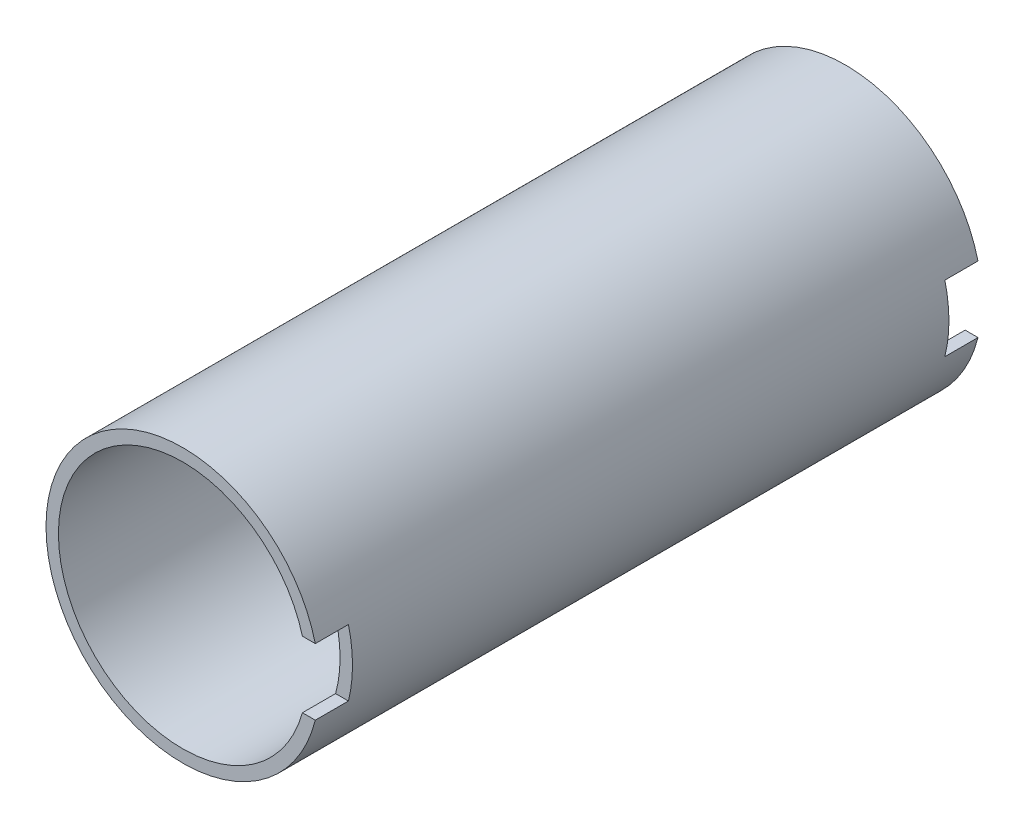
ISO-10303-21;
HEADER;
FILE_DESCRIPTION(('STEP AP214'),'2;1');
FILE_NAME('part.step','',(''),(''),'','','');
FILE_SCHEMA(('AUTOMOTIVE_DESIGN { 1 0 10303 214 1 1 1 1 }'));
ENDSEC;
DATA;
#1=APPLICATION_CONTEXT('core data for automotive mechanical design processes');
#2=APPLICATION_PROTOCOL_DEFINITION('international standard','automotive_design',2000,#1);
#3=PRODUCT_CONTEXT('',#1,'mechanical');
#4=PRODUCT('Part','Part','',(#3));
#5=PRODUCT_RELATED_PRODUCT_CATEGORY('part','',(#4));
#6=PRODUCT_DEFINITION_FORMATION('','',#4);
#7=PRODUCT_DEFINITION_CONTEXT('part definition',#1,'design');
#8=PRODUCT_DEFINITION('design','',#6,#7);
#9=PRODUCT_DEFINITION_SHAPE('','',#8);
#10=(LENGTH_UNIT() NAMED_UNIT(*) SI_UNIT(.MILLI.,.METRE.));
#11=(NAMED_UNIT(*) PLANE_ANGLE_UNIT() SI_UNIT($,.RADIAN.));
#12=(NAMED_UNIT(*) SI_UNIT($,.STERADIAN.) SOLID_ANGLE_UNIT());
#13=UNCERTAINTY_MEASURE_WITH_UNIT(LENGTH_MEASURE(1.E-05),#10,'distance_accuracy_value','');
#14=(GEOMETRIC_REPRESENTATION_CONTEXT(3) GLOBAL_UNCERTAINTY_ASSIGNED_CONTEXT((#13)) GLOBAL_UNIT_ASSIGNED_CONTEXT((#10,
#11,#12)) REPRESENTATION_CONTEXT('',''));
#15=CARTESIAN_POINT('',(0.,0.,0.));
#16=DIRECTION('',(0.,0.,1.));
#17=DIRECTION('',(1.,0.,0.));
#18=AXIS2_PLACEMENT_3D('',#15,#16,#17);
#19=CARTESIAN_POINT('',(0.,0.,40.));
#20=DIRECTION('',(0.,0.,1.));
#21=DIRECTION('',(1.,0.,0.));
#22=AXIS2_PLACEMENT_3D('',#19,#20,#21);
#23=PLANE('',#22);
#24=CARTESIAN_POINT('',(0.,0.,40.));
#25=DIRECTION('',(0.,0.,1.));
#26=DIRECTION('',(1.,0.,0.));
#27=AXIS2_PLACEMENT_3D('',#24,#25,#26);
#28=CIRCLE('',#27,16.5);
#29=CARTESIAN_POINT('',(16.0078105935821,4.,40.));
#30=VERTEX_POINT('',#29);
#31=CARTESIAN_POINT('',(16.0078105935821,-4.,40.));
#32=VERTEX_POINT('',#31);
#33=EDGE_CURVE('E143',#30,#32,#28,.T.);
#34=ORIENTED_EDGE('',*,*,#33,.T.);
#35=DIRECTION('',(-1.,0.,0.));
#36=VECTOR('',#35,1.);
#37=CARTESIAN_POINT('',(16.5,-4.,40.));
#38=LINE('',#37,#36);
#39=CARTESIAN_POINT('',(14.456832294801,-4.,40.));
#40=VERTEX_POINT('',#39);
#41=EDGE_CURVE('E164',#32,#40,#38,.T.);
#42=ORIENTED_EDGE('',*,*,#41,.T.);
#43=CARTESIAN_POINT('',(0.,0.,40.));
#44=DIRECTION('',(0.,0.,1.));
#45=DIRECTION('',(1.,0.,0.));
#46=AXIS2_PLACEMENT_3D('',#43,#44,#45);
#47=CIRCLE('',#46,15.);
#48=CARTESIAN_POINT('',(14.456832294801,4.,40.));
#49=VERTEX_POINT('',#48);
#50=EDGE_CURVE('E131',#49,#40,#47,.T.);
#51=ORIENTED_EDGE('',*,*,#50,.F.);
#52=DIRECTION('',(-1.,0.,0.));
#53=VECTOR('',#52,1.);
#54=CARTESIAN_POINT('',(16.5,4.,40.));
#55=LINE('',#54,#53);
#56=EDGE_CURVE('E67',#30,#49,#55,.T.);
#57=ORIENTED_EDGE('',*,*,#56,.F.);
#58=EDGE_LOOP('',(#34,#42,#51,#57));
#59=FACE_BOUND('',#58,.T.);
#60=ADVANCED_FACE('F43',(#59),#23,.T.);
#61=CARTESIAN_POINT('',(0.,0.,40.));
#62=DIRECTION('',(0.,0.,-1.));
#63=DIRECTION('',(-1.,0.,0.));
#64=AXIS2_PLACEMENT_3D('',#61,#62,#63);
#65=CYLINDRICAL_SURFACE('',#64,16.5);
#66=CARTESIAN_POINT('',(0.,0.,-36.));
#67=DIRECTION('',(0.,0.,1.));
#68=DIRECTION('',(1.,0.,0.));
#69=AXIS2_PLACEMENT_3D('',#66,#67,#68);
#70=CIRCLE('',#69,16.5);
#71=CARTESIAN_POINT('',(16.0078105935821,-4.,-36.));
#72=VERTEX_POINT('',#71);
#73=CARTESIAN_POINT('',(16.0078105935821,4.,-36.));
#74=VERTEX_POINT('',#73);
#75=EDGE_CURVE('E198',#72,#74,#70,.T.);
#76=ORIENTED_EDGE('',*,*,#75,.T.);
#77=DIRECTION('',(0.,0.,-1.));
#78=VECTOR('',#77,1.);
#79=CARTESIAN_POINT('',(16.0078105935821,4.,40.));
#80=LINE('',#79,#78);
#81=CARTESIAN_POINT('',(16.0078105935821,4.,-40.));
#82=VERTEX_POINT('',#81);
#83=EDGE_CURVE('E200',#74,#82,#80,.T.);
#84=ORIENTED_EDGE('',*,*,#83,.T.);
#85=CARTESIAN_POINT('',(0.,0.,-40.));
#86=DIRECTION('',(0.,0.,1.));
#87=DIRECTION('',(1.,0.,0.));
#88=AXIS2_PLACEMENT_3D('',#85,#86,#87);
#89=CIRCLE('',#88,16.5);
#90=CARTESIAN_POINT('',(16.0078105935821,-4.,-40.));
#91=VERTEX_POINT('',#90);
#92=EDGE_CURVE('E137',#82,#91,#89,.T.);
#93=ORIENTED_EDGE('',*,*,#92,.T.);
#94=DIRECTION('',(0.,0.,-1.));
#95=VECTOR('',#94,1.);
#96=CARTESIAN_POINT('',(16.0078105935821,-4.,40.));
#97=LINE('',#96,#95);
#98=EDGE_CURVE('E59',#91,#72,#97,.F.);
#99=ORIENTED_EDGE('',*,*,#98,.T.);
#100=EDGE_LOOP('',(#76,#84,#93,#99));
#101=FACE_BOUND('',#100,.T.);
#102=CARTESIAN_POINT('',(0.,0.,36.));
#103=DIRECTION('',(0.,0.,1.));
#104=DIRECTION('',(1.,0.,0.));
#105=AXIS2_PLACEMENT_3D('',#102,#103,#104);
#106=CIRCLE('',#105,16.5);
#107=CARTESIAN_POINT('',(16.0078105935821,-4.,36.));
#108=VERTEX_POINT('',#107);
#109=CARTESIAN_POINT('',(16.0078105935821,4.,36.));
#110=VERTEX_POINT('',#109);
#111=EDGE_CURVE('E140',#108,#110,#106,.T.);
#112=ORIENTED_EDGE('',*,*,#111,.F.);
#113=DIRECTION('',(0.,0.,-1.));
#114=VECTOR('',#113,1.);
#115=CARTESIAN_POINT('',(16.0078105935821,-4.,40.));
#116=LINE('',#115,#114);
#117=EDGE_CURVE('E132',#32,#108,#116,.T.);
#118=ORIENTED_EDGE('',*,*,#117,.F.);
#119=ORIENTED_EDGE('',*,*,#33,.F.);
#120=DIRECTION('',(0.,0.,-1.));
#121=VECTOR('',#120,1.);
#122=CARTESIAN_POINT('',(16.0078105935821,4.,40.));
#123=LINE('',#122,#121);
#124=EDGE_CURVE('E171',#110,#30,#123,.F.);
#125=ORIENTED_EDGE('',*,*,#124,.F.);
#126=EDGE_LOOP('',(#112,#118,#119,#125));
#127=FACE_BOUND('',#126,.T.);
#128=ADVANCED_FACE('F45',(#101,#127),#65,.T.);
#129=CARTESIAN_POINT('',(0.,0.,40.));
#130=DIRECTION('',(0.,0.,-1.));
#131=DIRECTION('',(-1.,0.,0.));
#132=AXIS2_PLACEMENT_3D('',#129,#130,#131);
#133=CYLINDRICAL_SURFACE('',#132,15.);
#134=DIRECTION('',(0.,0.,-1.));
#135=VECTOR('',#134,1.);
#136=CARTESIAN_POINT('',(14.456832294801,4.,40.));
#137=LINE('',#136,#135);
#138=CARTESIAN_POINT('',(14.456832294801,4.,-36.));
#139=VERTEX_POINT('',#138);
#140=CARTESIAN_POINT('',(14.456832294801,4.,-40.));
#141=VERTEX_POINT('',#140);
#142=EDGE_CURVE('E209',#139,#141,#137,.T.);
#143=ORIENTED_EDGE('',*,*,#142,.F.);
#144=CARTESIAN_POINT('',(0.,0.,-36.));
#145=DIRECTION('',(0.,0.,1.));
#146=DIRECTION('',(1.,0.,0.));
#147=AXIS2_PLACEMENT_3D('',#144,#145,#146);
#148=CIRCLE('',#147,15.);
#149=CARTESIAN_POINT('',(14.456832294801,-4.,-36.));
#150=VERTEX_POINT('',#149);
#151=EDGE_CURVE('E11',#150,#139,#148,.T.);
#152=ORIENTED_EDGE('',*,*,#151,.F.);
#153=DIRECTION('',(0.,0.,-1.));
#154=VECTOR('',#153,1.);
#155=CARTESIAN_POINT('',(14.456832294801,-4.,40.));
#156=LINE('',#155,#154);
#157=CARTESIAN_POINT('',(14.456832294801,-4.,-40.));
#158=VERTEX_POINT('',#157);
#159=EDGE_CURVE('E109',#158,#150,#156,.F.);
#160=ORIENTED_EDGE('',*,*,#159,.F.);
#161=CARTESIAN_POINT('',(0.,0.,-40.));
#162=DIRECTION('',(0.,0.,1.));
#163=DIRECTION('',(1.,0.,0.));
#164=AXIS2_PLACEMENT_3D('',#161,#162,#163);
#165=CIRCLE('',#164,15.);
#166=EDGE_CURVE('E124',#141,#158,#165,.T.);
#167=ORIENTED_EDGE('',*,*,#166,.F.);
#168=EDGE_LOOP('',(#143,#152,#160,#167));
#169=FACE_BOUND('',#168,.T.);
#170=ORIENTED_EDGE('',*,*,#50,.T.);
#171=DIRECTION('',(0.,0.,-1.));
#172=VECTOR('',#171,1.);
#173=CARTESIAN_POINT('',(14.456832294801,-4.,40.));
#174=LINE('',#173,#172);
#175=CARTESIAN_POINT('',(14.456832294801,-4.,36.));
#176=VERTEX_POINT('',#175);
#177=EDGE_CURVE('E116',#40,#176,#174,.T.);
#178=ORIENTED_EDGE('',*,*,#177,.T.);
#179=CARTESIAN_POINT('',(0.,0.,36.));
#180=DIRECTION('',(0.,0.,1.));
#181=DIRECTION('',(1.,0.,0.));
#182=AXIS2_PLACEMENT_3D('',#179,#180,#181);
#183=CIRCLE('',#182,15.);
#184=CARTESIAN_POINT('',(14.456832294801,4.,36.));
#185=VERTEX_POINT('',#184);
#186=EDGE_CURVE('E152',#176,#185,#183,.T.);
#187=ORIENTED_EDGE('',*,*,#186,.T.);
#188=DIRECTION('',(0.,0.,-1.));
#189=VECTOR('',#188,1.);
#190=CARTESIAN_POINT('',(14.456832294801,4.,40.));
#191=LINE('',#190,#189);
#192=EDGE_CURVE('E147',#185,#49,#191,.F.);
#193=ORIENTED_EDGE('',*,*,#192,.T.);
#194=EDGE_LOOP('',(#170,#178,#187,#193));
#195=FACE_BOUND('',#194,.T.);
#196=ADVANCED_FACE('F122',(#169,#195),#133,.F.);
#197=CARTESIAN_POINT('',(0.,0.,-40.));
#198=DIRECTION('',(0.,0.,1.));
#199=DIRECTION('',(1.,0.,0.));
#200=AXIS2_PLACEMENT_3D('',#197,#198,#199);
#201=PLANE('',#200);
#202=ORIENTED_EDGE('',*,*,#92,.F.);
#203=DIRECTION('',(-1.,0.,0.));
#204=VECTOR('',#203,1.);
#205=CARTESIAN_POINT('',(0.,4.,-40.));
#206=LINE('',#205,#204);
#207=EDGE_CURVE('E52',#82,#141,#206,.T.);
#208=ORIENTED_EDGE('',*,*,#207,.T.);
#209=ORIENTED_EDGE('',*,*,#166,.T.);
#210=DIRECTION('',(1.,0.,0.));
#211=VECTOR('',#210,1.);
#212=CARTESIAN_POINT('',(0.,-4.,-40.));
#213=LINE('',#212,#211);
#214=EDGE_CURVE('E106',#158,#91,#213,.T.);
#215=ORIENTED_EDGE('',*,*,#214,.T.);
#216=EDGE_LOOP('',(#202,#208,#209,#215));
#217=FACE_BOUND('',#216,.T.);
#218=ADVANCED_FACE('F129',(#217),#201,.F.);
#219=CARTESIAN_POINT('',(16.5,-4.,40.));
#220=DIRECTION('',(0.,1.,0.));
#221=DIRECTION('',(0.,0.,1.));
#222=AXIS2_PLACEMENT_3D('',#219,#220,#221);
#223=PLANE('',#222);
#224=ORIENTED_EDGE('',*,*,#117,.T.);
#225=DIRECTION('',(-1.,0.,0.));
#226=VECTOR('',#225,1.);
#227=CARTESIAN_POINT('',(16.5,-4.,36.));
#228=LINE('',#227,#226);
#229=EDGE_CURVE('E167',#108,#176,#228,.T.);
#230=ORIENTED_EDGE('',*,*,#229,.T.);
#231=ORIENTED_EDGE('',*,*,#177,.F.);
#232=ORIENTED_EDGE('',*,*,#41,.F.);
#233=EDGE_LOOP('',(#224,#230,#231,#232));
#234=FACE_BOUND('',#233,.T.);
#235=ADVANCED_FACE('F163',(#234),#223,.T.);
#236=CARTESIAN_POINT('',(16.5,4.,36.));
#237=DIRECTION('',(0.,0.,1.));
#238=DIRECTION('',(1.,0.,0.));
#239=AXIS2_PLACEMENT_3D('',#236,#237,#238);
#240=PLANE('',#239);
#241=ORIENTED_EDGE('',*,*,#111,.T.);
#242=DIRECTION('',(-1.,0.,0.));
#243=VECTOR('',#242,1.);
#244=CARTESIAN_POINT('',(16.5,4.,36.));
#245=LINE('',#244,#243);
#246=EDGE_CURVE('E176',#110,#185,#245,.T.);
#247=ORIENTED_EDGE('',*,*,#246,.T.);
#248=ORIENTED_EDGE('',*,*,#186,.F.);
#249=ORIENTED_EDGE('',*,*,#229,.F.);
#250=EDGE_LOOP('',(#241,#247,#248,#249));
#251=FACE_BOUND('',#250,.T.);
#252=ADVANCED_FACE('F184',(#251),#240,.T.);
#253=CARTESIAN_POINT('',(16.5,4.,40.));
#254=DIRECTION('',(0.,-1.,0.));
#255=DIRECTION('',(0.,0.,-1.));
#256=AXIS2_PLACEMENT_3D('',#253,#254,#255);
#257=PLANE('',#256);
#258=ORIENTED_EDGE('',*,*,#124,.T.);
#259=ORIENTED_EDGE('',*,*,#56,.T.);
#260=ORIENTED_EDGE('',*,*,#192,.F.);
#261=ORIENTED_EDGE('',*,*,#246,.F.);
#262=EDGE_LOOP('',(#258,#259,#260,#261));
#263=FACE_BOUND('',#262,.T.);
#264=ADVANCED_FACE('F187',(#263),#257,.T.);
#265=CARTESIAN_POINT('',(16.5,4.,-36.));
#266=DIRECTION('',(0.,0.,1.));
#267=DIRECTION('',(1.,0.,0.));
#268=AXIS2_PLACEMENT_3D('',#265,#266,#267);
#269=PLANE('',#268);
#270=ORIENTED_EDGE('',*,*,#75,.F.);
#271=DIRECTION('',(-1.,0.,0.));
#272=VECTOR('',#271,1.);
#273=CARTESIAN_POINT('',(16.5,-4.,-36.));
#274=LINE('',#273,#272);
#275=EDGE_CURVE('E213',#72,#150,#274,.T.);
#276=ORIENTED_EDGE('',*,*,#275,.T.);
#277=ORIENTED_EDGE('',*,*,#151,.T.);
#278=DIRECTION('',(-1.,0.,0.));
#279=VECTOR('',#278,1.);
#280=CARTESIAN_POINT('',(16.5,4.,-36.));
#281=LINE('',#280,#279);
#282=EDGE_CURVE('E126',#74,#139,#281,.T.);
#283=ORIENTED_EDGE('',*,*,#282,.F.);
#284=EDGE_LOOP('',(#270,#276,#277,#283));
#285=FACE_BOUND('',#284,.T.);
#286=ADVANCED_FACE('F211',(#285),#269,.F.);
#287=CARTESIAN_POINT('',(16.5,4.,-40.));
#288=DIRECTION('',(0.,1.,0.));
#289=DIRECTION('',(0.,0.,1.));
#290=AXIS2_PLACEMENT_3D('',#287,#288,#289);
#291=PLANE('',#290);
#292=ORIENTED_EDGE('',*,*,#282,.T.);
#293=ORIENTED_EDGE('',*,*,#142,.T.);
#294=ORIENTED_EDGE('',*,*,#207,.F.);
#295=ORIENTED_EDGE('',*,*,#83,.F.);
#296=EDGE_LOOP('',(#292,#293,#294,#295));
#297=FACE_BOUND('',#296,.T.);
#298=ADVANCED_FACE('F207',(#297),#291,.F.);
#299=CARTESIAN_POINT('',(16.5,-4.,-40.));
#300=DIRECTION('',(0.,-1.,0.));
#301=DIRECTION('',(0.,0.,-1.));
#302=AXIS2_PLACEMENT_3D('',#299,#300,#301);
#303=PLANE('',#302);
#304=ORIENTED_EDGE('',*,*,#214,.F.);
#305=ORIENTED_EDGE('',*,*,#159,.T.);
#306=ORIENTED_EDGE('',*,*,#275,.F.);
#307=ORIENTED_EDGE('',*,*,#98,.F.);
#308=EDGE_LOOP('',(#304,#305,#306,#307));
#309=FACE_BOUND('',#308,.T.);
#310=ADVANCED_FACE('F108',(#309),#303,.F.);
#311=CLOSED_SHELL('',(#60,#128,#196,#218,#235,#252,#264,#286,#298,#310));
#312=MANIFOLD_SOLID_BREP('B2',#311);
#313=ADVANCED_BREP_SHAPE_REPRESENTATION('',(#18,#312),#14);
#314=SHAPE_DEFINITION_REPRESENTATION(#9,#313);
ENDSEC;
END-ISO-10303-21;
